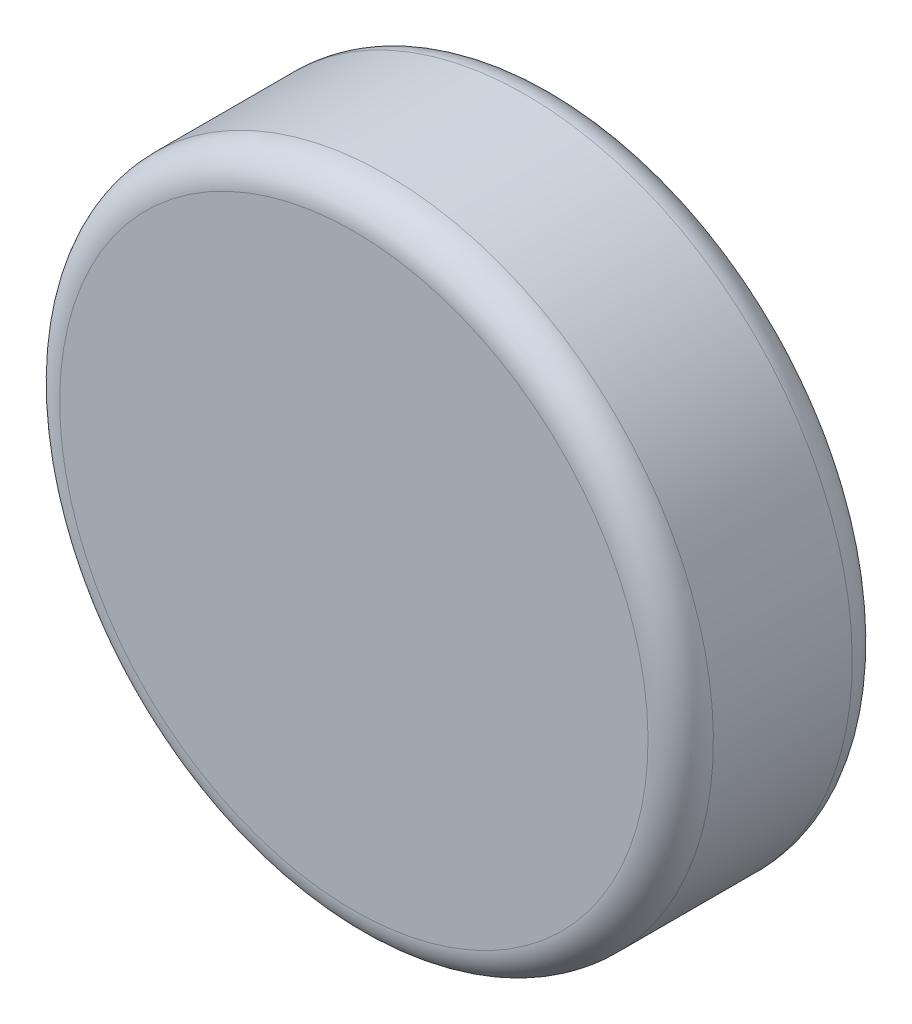
ISO-10303-21;
HEADER;
FILE_DESCRIPTION(('STEP AP214'),'2;1');
FILE_NAME('part.step','',(''),(''),'','','');
FILE_SCHEMA(('AUTOMOTIVE_DESIGN { 1 0 10303 214 1 1 1 1 }'));
ENDSEC;
DATA;
#1=APPLICATION_CONTEXT('core data for automotive mechanical design processes');
#2=APPLICATION_PROTOCOL_DEFINITION('international standard','automotive_design',2000,#1);
#3=PRODUCT_CONTEXT('',#1,'mechanical');
#4=PRODUCT('Part','Part','',(#3));
#5=PRODUCT_RELATED_PRODUCT_CATEGORY('part','',(#4));
#6=PRODUCT_DEFINITION_FORMATION('','',#4);
#7=PRODUCT_DEFINITION_CONTEXT('part definition',#1,'design');
#8=PRODUCT_DEFINITION('design','',#6,#7);
#9=PRODUCT_DEFINITION_SHAPE('','',#8);
#10=(LENGTH_UNIT() NAMED_UNIT(*) SI_UNIT(.MILLI.,.METRE.));
#11=(NAMED_UNIT(*) PLANE_ANGLE_UNIT() SI_UNIT($,.RADIAN.));
#12=(NAMED_UNIT(*) SI_UNIT($,.STERADIAN.) SOLID_ANGLE_UNIT());
#13=UNCERTAINTY_MEASURE_WITH_UNIT(LENGTH_MEASURE(1.E-05),#10,'distance_accuracy_value','');
#14=(GEOMETRIC_REPRESENTATION_CONTEXT(3) GLOBAL_UNCERTAINTY_ASSIGNED_CONTEXT((#13)) GLOBAL_UNIT_ASSIGNED_CONTEXT((#10,
#11,#12)) REPRESENTATION_CONTEXT('',''));
#15=CARTESIAN_POINT('',(0.,0.,0.));
#16=DIRECTION('',(0.,0.,1.));
#17=DIRECTION('',(1.,0.,0.));
#18=AXIS2_PLACEMENT_3D('',#15,#16,#17);
#19=CARTESIAN_POINT('',(-4.94999999999773,-15.4000004676844,14.395));
#20=DIRECTION('',(0.,0.,1.));
#21=DIRECTION('',(0.,-1.,0.));
#22=AXIS2_PLACEMENT_3D('',#19,#20,#21);
#23=CYLINDRICAL_SURFACE('',#22,4.00000000000001);
#24=CARTESIAN_POINT('',(-4.94999999999773,-15.4000004676844,16.495));
#25=DIRECTION('',(0.,0.,-1.));
#26=DIRECTION('',(0.,1.,0.));
#27=AXIS2_PLACEMENT_3D('',#24,#25,#26);
#28=CIRCLE('',#27,4.00000000000001);
#29=CARTESIAN_POINT('',(-4.94999999999773,-11.4000004676844,16.495));
#30=VERTEX_POINT('',#29);
#31=EDGE_CURVE('E48',#30,#30,#28,.T.);
#32=ORIENTED_EDGE('',*,*,#31,.T.);
#33=EDGE_LOOP('',(#32));
#34=FACE_BOUND('',#33,.T.);
#35=CARTESIAN_POINT('',(-4.94999999999773,-15.4000004676844,14.795));
#36=DIRECTION('',(0.,0.,-1.));
#37=DIRECTION('',(0.,1.,0.));
#38=AXIS2_PLACEMENT_3D('',#35,#36,#37);
#39=CIRCLE('',#38,4.00000000000001);
#40=CARTESIAN_POINT('',(-4.94999999999773,-11.4000004676844,14.795));
#41=VERTEX_POINT('',#40);
#42=EDGE_CURVE('E55',#41,#41,#39,.F.);
#43=ORIENTED_EDGE('',*,*,#42,.T.);
#44=EDGE_LOOP('',(#43));
#45=FACE_BOUND('',#44,.T.);
#46=ADVANCED_FACE('F40',(#34,#45),#23,.T.);
#47=CARTESIAN_POINT('',(-4.94999999999773,-15.4000004676844,14.395));
#48=DIRECTION('',(0.,0.,-1.));
#49=DIRECTION('',(0.,1.,0.));
#50=AXIS2_PLACEMENT_3D('',#47,#48,#49);
#51=PLANE('',#50);
#52=CARTESIAN_POINT('',(-4.94999999999773,-15.4000004676844,14.395));
#53=DIRECTION('',(0.,0.,-1.));
#54=DIRECTION('',(0.,1.,0.));
#55=AXIS2_PLACEMENT_3D('',#52,#53,#54);
#56=CIRCLE('',#55,3.60000000000001);
#57=CARTESIAN_POINT('',(-4.94999999999773,-11.8000004676844,14.395));
#58=VERTEX_POINT('',#57);
#59=EDGE_CURVE('E10',#58,#58,#56,.T.);
#60=ORIENTED_EDGE('',*,*,#59,.T.);
#61=EDGE_LOOP('',(#60));
#62=FACE_BOUND('',#61,.T.);
#63=ADVANCED_FACE('F67',(#62),#51,.T.);
#64=CARTESIAN_POINT('',(-4.94999999999773,-15.4000004676844,16.895));
#65=DIRECTION('',(0.,0.,-1.));
#66=DIRECTION('',(0.,1.,0.));
#67=AXIS2_PLACEMENT_3D('',#64,#65,#66);
#68=PLANE('',#67);
#69=CARTESIAN_POINT('',(-4.94999999999773,-15.4000004676844,16.895));
#70=DIRECTION('',(0.,0.,-1.));
#71=DIRECTION('',(0.,1.,0.));
#72=AXIS2_PLACEMENT_3D('',#69,#70,#71);
#73=CIRCLE('',#72,3.60000000000001);
#74=CARTESIAN_POINT('',(-4.94999999999773,-11.8000004676844,16.895));
#75=VERTEX_POINT('',#74);
#76=EDGE_CURVE('E42',#75,#75,#73,.F.);
#77=ORIENTED_EDGE('',*,*,#76,.T.);
#78=EDGE_LOOP('',(#77));
#79=FACE_BOUND('',#78,.T.);
#80=ADVANCED_FACE('F61',(#79),#68,.F.);
#81=CARTESIAN_POINT('',(-4.94999999999773,-15.4000004676844,16.495));
#82=DIRECTION('',(0.,0.,-1.));
#83=DIRECTION('',(0.,1.,0.));
#84=AXIS2_PLACEMENT_3D('',#81,#82,#83);
#85=TOROIDAL_SURFACE('',#84,3.60000000000001,0.4);
#86=ORIENTED_EDGE('',*,*,#76,.F.);
#87=EDGE_LOOP('',(#86));
#88=FACE_BOUND('',#87,.T.);
#89=ORIENTED_EDGE('',*,*,#31,.F.);
#90=EDGE_LOOP('',(#89));
#91=FACE_BOUND('',#90,.T.);
#92=ADVANCED_FACE('F63',(#88,#91),#85,.T.);
#93=CARTESIAN_POINT('',(-4.94999999999773,-15.4000004676844,14.795));
#94=DIRECTION('',(0.,0.,-1.));
#95=DIRECTION('',(0.,1.,0.));
#96=AXIS2_PLACEMENT_3D('',#93,#94,#95);
#97=TOROIDAL_SURFACE('',#96,3.60000000000001,0.4);
#98=ORIENTED_EDGE('',*,*,#42,.F.);
#99=EDGE_LOOP('',(#98));
#100=FACE_BOUND('',#99,.T.);
#101=ORIENTED_EDGE('',*,*,#59,.F.);
#102=EDGE_LOOP('',(#101));
#103=FACE_BOUND('',#102,.T.);
#104=ADVANCED_FACE('F39',(#100,#103),#97,.T.);
#105=CLOSED_SHELL('',(#46,#63,#80,#92,#104));
#106=MANIFOLD_SOLID_BREP('B2',#105);
#107=ADVANCED_BREP_SHAPE_REPRESENTATION('',(#18,#106),#14);
#108=SHAPE_DEFINITION_REPRESENTATION(#9,#107);
ENDSEC;
END-ISO-10303-21;
